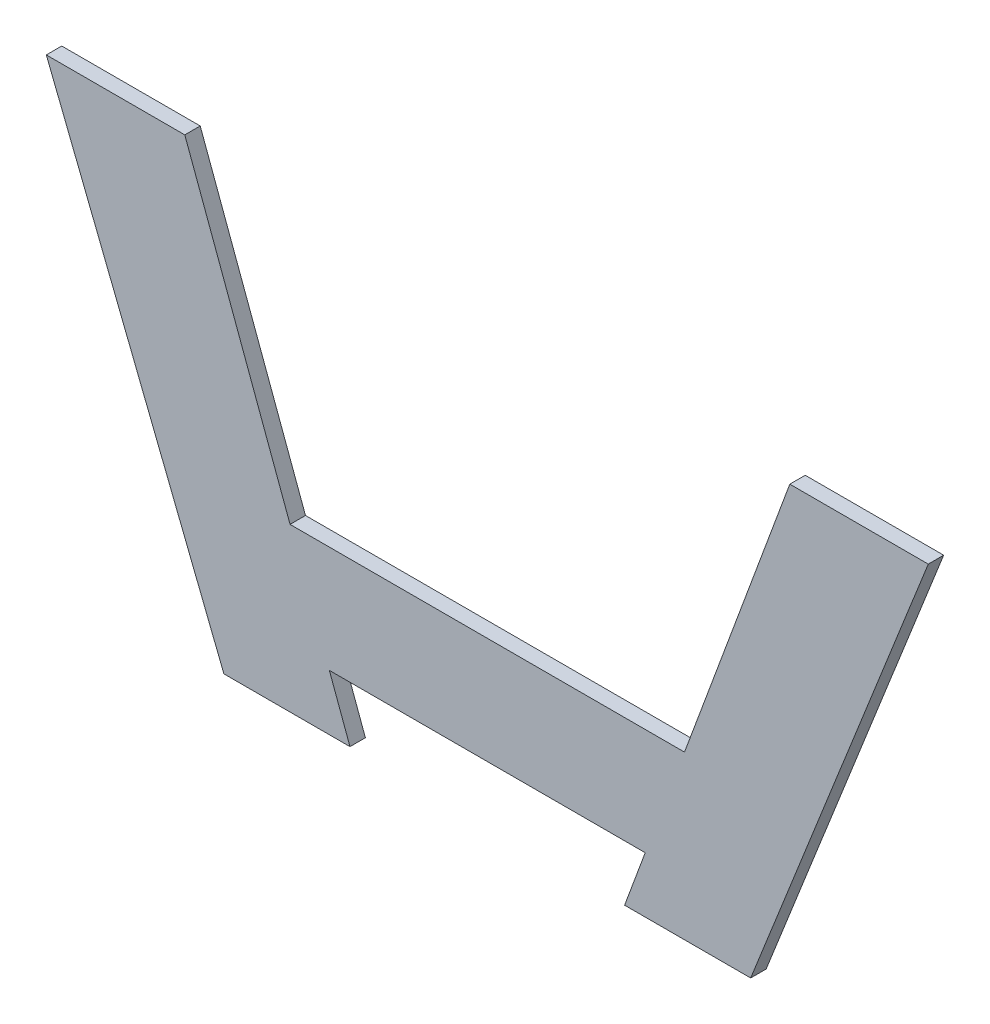
ISO-10303-21;
HEADER;
FILE_DESCRIPTION(('STEP AP214'),'2;1');
FILE_NAME('part.step','',(''),(''),'','','');
FILE_SCHEMA(('AUTOMOTIVE_DESIGN { 1 0 10303 214 1 1 1 1 }'));
ENDSEC;
DATA;
#1=APPLICATION_CONTEXT('core data for automotive mechanical design processes');
#2=APPLICATION_PROTOCOL_DEFINITION('international standard','automotive_design',2000,#1);
#3=PRODUCT_CONTEXT('',#1,'mechanical');
#4=PRODUCT('Part','Part','',(#3));
#5=PRODUCT_RELATED_PRODUCT_CATEGORY('part','',(#4));
#6=PRODUCT_DEFINITION_FORMATION('','',#4);
#7=PRODUCT_DEFINITION_CONTEXT('part definition',#1,'design');
#8=PRODUCT_DEFINITION('design','',#6,#7);
#9=PRODUCT_DEFINITION_SHAPE('','',#8);
#10=(LENGTH_UNIT() NAMED_UNIT(*) SI_UNIT(.MILLI.,.METRE.));
#11=(NAMED_UNIT(*) PLANE_ANGLE_UNIT() SI_UNIT($,.RADIAN.));
#12=(NAMED_UNIT(*) SI_UNIT($,.STERADIAN.) SOLID_ANGLE_UNIT());
#13=UNCERTAINTY_MEASURE_WITH_UNIT(LENGTH_MEASURE(1.E-05),#10,'distance_accuracy_value','');
#14=(GEOMETRIC_REPRESENTATION_CONTEXT(3) GLOBAL_UNCERTAINTY_ASSIGNED_CONTEXT((#13)) GLOBAL_UNIT_ASSIGNED_CONTEXT((#10,
#11,#12)) REPRESENTATION_CONTEXT('',''));
#15=CARTESIAN_POINT('',(0.,0.,0.));
#16=DIRECTION('',(0.,0.,1.));
#17=DIRECTION('',(1.,0.,0.));
#18=AXIS2_PLACEMENT_3D('',#15,#16,#17);
#19=CARTESIAN_POINT('',(14.4891826923077,15.,0.5));
#20=DIRECTION('',(-0.929423825762679,0.369014026975487,0.));
#21=DIRECTION('',(-0.369014026975487,-0.929423825762679,0.));
#22=AXIS2_PLACEMENT_3D('',#19,#20,#21);
#23=PLANE('',#22);
#24=DIRECTION('',(-0.369014026975487,-0.929423825762679,0.));
#25=VECTOR('',#24,1.);
#26=CARTESIAN_POINT('',(14.4891826923077,15.,1.));
#27=LINE('',#26,#25);
#28=CARTESIAN_POINT('',(14.4891826923077,15.,1.));
#29=VERTEX_POINT('',#28);
#30=CARTESIAN_POINT('',(8.73217147435897,0.5,1.));
#31=VERTEX_POINT('',#30);
#32=EDGE_CURVE('E163',#29,#31,#27,.T.);
#33=ORIENTED_EDGE('',*,*,#32,.T.);
#34=DIRECTION('',(0.,0.,-1.));
#35=VECTOR('',#34,1.);
#36=CARTESIAN_POINT('',(8.73217147435897,0.5,0.5));
#37=LINE('',#36,#35);
#38=CARTESIAN_POINT('',(8.73217147435897,0.5,0.5));
#39=VERTEX_POINT('',#38);
#40=EDGE_CURVE('E60',#31,#39,#37,.T.);
#41=ORIENTED_EDGE('',*,*,#40,.T.);
#42=DIRECTION('',(-0.369014026975487,-0.929423825762679,0.));
#43=VECTOR('',#42,1.);
#44=CARTESIAN_POINT('',(14.4891826923077,15.,0.5));
#45=LINE('',#44,#43);
#46=CARTESIAN_POINT('',(14.4891826923077,15.,0.5));
#47=VERTEX_POINT('',#46);
#48=EDGE_CURVE('E158',#47,#39,#45,.T.);
#49=ORIENTED_EDGE('',*,*,#48,.F.);
#50=DIRECTION('',(0.,0.,1.));
#51=VECTOR('',#50,1.);
#52=CARTESIAN_POINT('',(14.4891826923077,15.,0.5));
#53=LINE('',#52,#51);
#54=EDGE_CURVE('E137',#47,#29,#53,.T.);
#55=ORIENTED_EDGE('',*,*,#54,.T.);
#56=EDGE_LOOP('',(#33,#41,#49,#55));
#57=FACE_BOUND('',#56,.T.);
#58=ADVANCED_FACE('F39',(#57),#23,.F.);
#59=CARTESIAN_POINT('',(-2.19350961538462,-15.,0.5));
#60=DIRECTION('',(0.929423825762679,0.369014026975487,0.));
#61=DIRECTION('',(-0.369014026975487,0.929423825762679,0.));
#62=AXIS2_PLACEMENT_3D('',#59,#60,#61);
#63=PLANE('',#62);
#64=DIRECTION('',(-0.369014026975487,0.929423825762679,0.));
#65=VECTOR('',#64,1.);
#66=CARTESIAN_POINT('',(-2.19350961538462,-15.,0.5));
#67=LINE('',#66,#65);
#68=CARTESIAN_POINT('',(-8.34755608974359,0.5,0.5));
#69=VERTEX_POINT('',#68);
#70=CARTESIAN_POINT('',(-14.1045673076923,15.,0.5));
#71=VERTEX_POINT('',#70);
#72=EDGE_CURVE('E143',#69,#71,#67,.T.);
#73=ORIENTED_EDGE('',*,*,#72,.F.);
#74=DIRECTION('',(0.,0.,1.));
#75=VECTOR('',#74,1.);
#76=CARTESIAN_POINT('',(-8.34755608974359,0.5,0.5));
#77=LINE('',#76,#75);
#78=CARTESIAN_POINT('',(-8.34755608974359,0.5,1.));
#79=VERTEX_POINT('',#78);
#80=EDGE_CURVE('E135',#69,#79,#77,.T.);
#81=ORIENTED_EDGE('',*,*,#80,.T.);
#82=DIRECTION('',(-0.369014026975487,0.929423825762679,0.));
#83=VECTOR('',#82,1.);
#84=CARTESIAN_POINT('',(-2.19350961538462,-15.,1.));
#85=LINE('',#84,#83);
#86=CARTESIAN_POINT('',(-14.1045673076923,15.,1.));
#87=VERTEX_POINT('',#86);
#88=EDGE_CURVE('E138',#79,#87,#85,.T.);
#89=ORIENTED_EDGE('',*,*,#88,.T.);
#90=DIRECTION('',(0.,0.,1.));
#91=VECTOR('',#90,1.);
#92=CARTESIAN_POINT('',(-14.1045673076923,15.,0.5));
#93=LINE('',#92,#91);
#94=EDGE_CURVE('E152',#71,#87,#93,.T.);
#95=ORIENTED_EDGE('',*,*,#94,.F.);
#96=EDGE_LOOP('',(#73,#81,#89,#95));
#97=FACE_BOUND('',#96,.T.);
#98=ADVANCED_FACE('F146',(#97),#63,.F.);
#99=CARTESIAN_POINT('',(0.,0.,0.5));
#100=DIRECTION('',(0.,0.,-1.));
#101=DIRECTION('',(-1.,0.,0.));
#102=AXIS2_PLACEMENT_3D('',#99,#100,#101);
#103=PLANE('',#102);
#104=DIRECTION('',(1.,0.,0.));
#105=VECTOR('',#104,1.);
#106=CARTESIAN_POINT('',(0.,0.5,0.5));
#107=LINE('',#106,#105);
#108=CARTESIAN_POINT('',(-4.25964469981238,0.5,0.5));
#109=VERTEX_POINT('',#108);
#110=EDGE_CURVE('E47',#69,#109,#107,.T.);
#111=ORIENTED_EDGE('',*,*,#110,.F.);
#112=ORIENTED_EDGE('',*,*,#72,.T.);
#113=DIRECTION('',(1.,0.,0.));
#114=VECTOR('',#113,1.);
#115=CARTESIAN_POINT('',(-14.1045673076923,15.,0.5));
#116=LINE('',#115,#114);
#117=CARTESIAN_POINT('',(-9.61538461538462,15.,0.5));
#118=VERTEX_POINT('',#117);
#119=EDGE_CURVE('E155',#71,#118,#116,.T.);
#120=ORIENTED_EDGE('',*,*,#119,.T.);
#121=DIRECTION('',(0.346837004095032,-0.937925419524593,0.));
#122=VECTOR('',#121,1.);
#123=CARTESIAN_POINT('',(-9.61538461538462,15.,0.5));
#124=LINE('',#123,#122);
#125=CARTESIAN_POINT('',(-6.20192307692308,5.76923076923077,0.5));
#126=VERTEX_POINT('',#125);
#127=EDGE_CURVE('E153',#118,#126,#124,.T.);
#128=ORIENTED_EDGE('',*,*,#127,.T.);
#129=DIRECTION('',(1.,0.,0.));
#130=VECTOR('',#129,1.);
#131=CARTESIAN_POINT('',(-6.20192307692308,5.76923076923077,0.5));
#132=LINE('',#131,#130);
#133=CARTESIAN_POINT('',(6.58653846153846,5.76923076923077,0.5));
#134=VERTEX_POINT('',#133);
#135=EDGE_CURVE('E197',#126,#134,#132,.T.);
#136=ORIENTED_EDGE('',*,*,#135,.T.);
#137=DIRECTION('',(0.346837004095032,0.937925419524593,0.));
#138=VECTOR('',#137,1.);
#139=CARTESIAN_POINT('',(6.58653846153846,5.76923076923077,0.5));
#140=LINE('',#139,#138);
#141=CARTESIAN_POINT('',(10.,15.,0.5));
#142=VERTEX_POINT('',#141);
#143=EDGE_CURVE('E194',#134,#142,#140,.T.);
#144=ORIENTED_EDGE('',*,*,#143,.T.);
#145=DIRECTION('',(1.,0.,0.));
#146=VECTOR('',#145,1.);
#147=CARTESIAN_POINT('',(10.,15.,0.5));
#148=LINE('',#147,#146);
#149=EDGE_CURVE('E165',#142,#47,#148,.T.);
#150=ORIENTED_EDGE('',*,*,#149,.T.);
#151=ORIENTED_EDGE('',*,*,#48,.T.);
#152=CARTESIAN_POINT('',(4.64409857508627,0.5,0.5));
#153=VERTEX_POINT('',#152);
#154=EDGE_CURVE('E11',#153,#39,#107,.T.);
#155=ORIENTED_EDGE('',*,*,#154,.F.);
#156=DIRECTION('',(0.346805908159069,0.93793691795662,0.));
#157=VECTOR('',#156,1.);
#158=CARTESIAN_POINT('',(2.24158653846154,-5.99759615384616,0.5));
#159=LINE('',#158,#157);
#160=CARTESIAN_POINT('',(5.3125,2.30769230769231,0.5));
#161=VERTEX_POINT('',#160);
#162=EDGE_CURVE('E164',#153,#161,#159,.T.);
#163=ORIENTED_EDGE('',*,*,#162,.T.);
#164=DIRECTION('',(-1.,0.,0.));
#165=VECTOR('',#164,1.);
#166=CARTESIAN_POINT('',(5.3125,2.30769230769231,0.5));
#167=LINE('',#166,#165);
#168=CARTESIAN_POINT('',(-4.92788461538462,2.30769230769231,0.5));
#169=VERTEX_POINT('',#168);
#170=EDGE_CURVE('E170',#161,#169,#167,.T.);
#171=ORIENTED_EDGE('',*,*,#170,.T.);
#172=DIRECTION('',(0.346732183468385,-0.937964174660869,0.));
#173=VECTOR('',#172,1.);
#174=CARTESIAN_POINT('',(-4.92788461538462,2.30769230769231,0.5));
#175=LINE('',#174,#173);
#176=EDGE_CURVE('E150',#169,#109,#175,.T.);
#177=ORIENTED_EDGE('',*,*,#176,.T.);
#178=EDGE_LOOP('',(#111,#112,#120,#128,#136,#144,#150,#151,#155,#163,#171,#177));
#179=FACE_BOUND('',#178,.T.);
#180=ADVANCED_FACE('F142',(#179),#103,.T.);
#181=CARTESIAN_POINT('',(0.,0.,1.));
#182=DIRECTION('',(0.,0.,-1.));
#183=DIRECTION('',(-1.,0.,0.));
#184=AXIS2_PLACEMENT_3D('',#181,#182,#183);
#185=PLANE('',#184);
#186=ORIENTED_EDGE('',*,*,#88,.F.);
#187=DIRECTION('',(1.,0.,0.));
#188=VECTOR('',#187,1.);
#189=CARTESIAN_POINT('',(-17.,0.5,1.));
#190=LINE('',#189,#188);
#191=CARTESIAN_POINT('',(-4.25964469981238,0.5,1.));
#192=VERTEX_POINT('',#191);
#193=EDGE_CURVE('E132',#79,#192,#190,.T.);
#194=ORIENTED_EDGE('',*,*,#193,.T.);
#195=DIRECTION('',(0.346732183468385,-0.937964174660869,0.));
#196=VECTOR('',#195,1.);
#197=CARTESIAN_POINT('',(-4.92788461538462,2.30769230769231,1.));
#198=LINE('',#197,#196);
#199=CARTESIAN_POINT('',(-4.92788461538462,2.30769230769231,1.));
#200=VERTEX_POINT('',#199);
#201=EDGE_CURVE('E169',#200,#192,#198,.T.);
#202=ORIENTED_EDGE('',*,*,#201,.F.);
#203=DIRECTION('',(-1.,0.,0.));
#204=VECTOR('',#203,1.);
#205=CARTESIAN_POINT('',(5.3125,2.30769230769231,1.));
#206=LINE('',#205,#204);
#207=CARTESIAN_POINT('',(5.3125,2.30769230769231,1.));
#208=VERTEX_POINT('',#207);
#209=EDGE_CURVE('E184',#208,#200,#206,.T.);
#210=ORIENTED_EDGE('',*,*,#209,.F.);
#211=DIRECTION('',(0.346805908159069,0.93793691795662,0.));
#212=VECTOR('',#211,1.);
#213=CARTESIAN_POINT('',(2.24158653846154,-5.99759615384616,1.));
#214=LINE('',#213,#212);
#215=CARTESIAN_POINT('',(4.64409857508627,0.5,1.));
#216=VERTEX_POINT('',#215);
#217=EDGE_CURVE('E43',#216,#208,#214,.T.);
#218=ORIENTED_EDGE('',*,*,#217,.F.);
#219=EDGE_CURVE('E127',#216,#31,#190,.T.);
#220=ORIENTED_EDGE('',*,*,#219,.T.);
#221=ORIENTED_EDGE('',*,*,#32,.F.);
#222=DIRECTION('',(1.,0.,0.));
#223=VECTOR('',#222,1.);
#224=CARTESIAN_POINT('',(10.,15.,1.));
#225=LINE('',#224,#223);
#226=CARTESIAN_POINT('',(10.,15.,1.));
#227=VERTEX_POINT('',#226);
#228=EDGE_CURVE('E189',#227,#29,#225,.T.);
#229=ORIENTED_EDGE('',*,*,#228,.F.);
#230=DIRECTION('',(0.346837004095032,0.937925419524593,0.));
#231=VECTOR('',#230,1.);
#232=CARTESIAN_POINT('',(6.58653846153846,5.76923076923077,1.));
#233=LINE('',#232,#231);
#234=CARTESIAN_POINT('',(6.58653846153846,5.76923076923077,1.));
#235=VERTEX_POINT('',#234);
#236=EDGE_CURVE('E208',#235,#227,#233,.T.);
#237=ORIENTED_EDGE('',*,*,#236,.F.);
#238=DIRECTION('',(1.,0.,0.));
#239=VECTOR('',#238,1.);
#240=CARTESIAN_POINT('',(-6.20192307692308,5.76923076923077,1.));
#241=LINE('',#240,#239);
#242=CARTESIAN_POINT('',(-6.20192307692308,5.76923076923077,1.));
#243=VERTEX_POINT('',#242);
#244=EDGE_CURVE('E209',#243,#235,#241,.T.);
#245=ORIENTED_EDGE('',*,*,#244,.F.);
#246=DIRECTION('',(0.346837004095032,-0.937925419524593,0.));
#247=VECTOR('',#246,1.);
#248=CARTESIAN_POINT('',(-9.61538461538462,15.,1.));
#249=LINE('',#248,#247);
#250=CARTESIAN_POINT('',(-9.61538461538462,15.,1.));
#251=VERTEX_POINT('',#250);
#252=EDGE_CURVE('E204',#251,#243,#249,.T.);
#253=ORIENTED_EDGE('',*,*,#252,.F.);
#254=DIRECTION('',(1.,0.,0.));
#255=VECTOR('',#254,1.);
#256=CARTESIAN_POINT('',(-14.1045673076923,15.,1.));
#257=LINE('',#256,#255);
#258=EDGE_CURVE('E205',#87,#251,#257,.T.);
#259=ORIENTED_EDGE('',*,*,#258,.F.);
#260=EDGE_LOOP('',(#186,#194,#202,#210,#218,#220,#221,#229,#237,#245,#253,#259));
#261=FACE_BOUND('',#260,.T.);
#262=ADVANCED_FACE('F41',(#261),#185,.F.);
#263=CARTESIAN_POINT('',(2.24158653846154,-5.99759615384616,0.5));
#264=DIRECTION('',(0.93793691795662,-0.346805908159069,0.));
#265=DIRECTION('',(0.346805908159069,0.93793691795662,0.));
#266=AXIS2_PLACEMENT_3D('',#263,#264,#265);
#267=PLANE('',#266);
#268=ORIENTED_EDGE('',*,*,#162,.F.);
#269=DIRECTION('',(0.,0.,1.));
#270=VECTOR('',#269,1.);
#271=CARTESIAN_POINT('',(4.64409857508627,0.5,0.5));
#272=LINE('',#271,#270);
#273=EDGE_CURVE('E126',#153,#216,#272,.T.);
#274=ORIENTED_EDGE('',*,*,#273,.T.);
#275=ORIENTED_EDGE('',*,*,#217,.T.);
#276=DIRECTION('',(0.,0.,1.));
#277=VECTOR('',#276,1.);
#278=CARTESIAN_POINT('',(5.3125,2.30769230769231,0.5));
#279=LINE('',#278,#277);
#280=EDGE_CURVE('E149',#161,#208,#279,.T.);
#281=ORIENTED_EDGE('',*,*,#280,.F.);
#282=EDGE_LOOP('',(#268,#274,#275,#281));
#283=FACE_BOUND('',#282,.T.);
#284=ADVANCED_FACE('F240',(#283),#267,.F.);
#285=CARTESIAN_POINT('',(-4.92788461538462,2.30769230769231,0.5));
#286=DIRECTION('',(-0.937964174660869,-0.346732183468385,0.));
#287=DIRECTION('',(0.346732183468385,-0.937964174660869,0.));
#288=AXIS2_PLACEMENT_3D('',#285,#286,#287);
#289=PLANE('',#288);
#290=ORIENTED_EDGE('',*,*,#201,.T.);
#291=DIRECTION('',(0.,0.,-1.));
#292=VECTOR('',#291,1.);
#293=CARTESIAN_POINT('',(-4.25964469981238,0.5,0.5));
#294=LINE('',#293,#292);
#295=EDGE_CURVE('E72',#192,#109,#294,.T.);
#296=ORIENTED_EDGE('',*,*,#295,.T.);
#297=ORIENTED_EDGE('',*,*,#176,.F.);
#298=DIRECTION('',(0.,0.,1.));
#299=VECTOR('',#298,1.);
#300=CARTESIAN_POINT('',(-4.92788461538462,2.30769230769231,0.5));
#301=LINE('',#300,#299);
#302=EDGE_CURVE('E174',#169,#200,#301,.T.);
#303=ORIENTED_EDGE('',*,*,#302,.T.);
#304=EDGE_LOOP('',(#290,#296,#297,#303));
#305=FACE_BOUND('',#304,.T.);
#306=ADVANCED_FACE('F258',(#305),#289,.F.);
#307=CARTESIAN_POINT('',(10.,15.,0.5));
#308=DIRECTION('',(0.,-1.,0.));
#309=DIRECTION('',(0.,0.,-1.));
#310=AXIS2_PLACEMENT_3D('',#307,#308,#309);
#311=PLANE('',#310);
#312=ORIENTED_EDGE('',*,*,#228,.T.);
#313=ORIENTED_EDGE('',*,*,#54,.F.);
#314=ORIENTED_EDGE('',*,*,#149,.F.);
#315=DIRECTION('',(0.,0.,1.));
#316=VECTOR('',#315,1.);
#317=CARTESIAN_POINT('',(10.,15.,0.5));
#318=LINE('',#317,#316);
#319=EDGE_CURVE('E202',#142,#227,#318,.T.);
#320=ORIENTED_EDGE('',*,*,#319,.T.);
#321=EDGE_LOOP('',(#312,#313,#314,#320));
#322=FACE_BOUND('',#321,.T.);
#323=ADVANCED_FACE('F230',(#322),#311,.F.);
#324=CARTESIAN_POINT('',(-14.1045673076923,15.,0.5));
#325=DIRECTION('',(0.,-1.,0.));
#326=DIRECTION('',(0.,0.,-1.));
#327=AXIS2_PLACEMENT_3D('',#324,#325,#326);
#328=PLANE('',#327);
#329=ORIENTED_EDGE('',*,*,#258,.T.);
#330=DIRECTION('',(0.,0.,1.));
#331=VECTOR('',#330,1.);
#332=CARTESIAN_POINT('',(-9.61538461538462,15.,0.5));
#333=LINE('',#332,#331);
#334=EDGE_CURVE('E207',#118,#251,#333,.T.);
#335=ORIENTED_EDGE('',*,*,#334,.F.);
#336=ORIENTED_EDGE('',*,*,#119,.F.);
#337=ORIENTED_EDGE('',*,*,#94,.T.);
#338=EDGE_LOOP('',(#329,#335,#336,#337));
#339=FACE_BOUND('',#338,.T.);
#340=ADVANCED_FACE('F379',(#339),#328,.F.);
#341=CARTESIAN_POINT('',(-9.61538461538462,15.,0.5));
#342=DIRECTION('',(-0.937925419524593,-0.346837004095032,0.));
#343=DIRECTION('',(0.346837004095032,-0.937925419524593,0.));
#344=AXIS2_PLACEMENT_3D('',#341,#342,#343);
#345=PLANE('',#344);
#346=ORIENTED_EDGE('',*,*,#252,.T.);
#347=DIRECTION('',(0.,0.,1.));
#348=VECTOR('',#347,1.);
#349=CARTESIAN_POINT('',(-6.20192307692308,5.76923076923077,0.5));
#350=LINE('',#349,#348);
#351=EDGE_CURVE('E206',#126,#243,#350,.T.);
#352=ORIENTED_EDGE('',*,*,#351,.F.);
#353=ORIENTED_EDGE('',*,*,#127,.F.);
#354=ORIENTED_EDGE('',*,*,#334,.T.);
#355=EDGE_LOOP('',(#346,#352,#353,#354));
#356=FACE_BOUND('',#355,.T.);
#357=ADVANCED_FACE('F367',(#356),#345,.F.);
#358=CARTESIAN_POINT('',(-6.20192307692308,5.76923076923077,0.5));
#359=DIRECTION('',(0.,-1.,0.));
#360=DIRECTION('',(0.,0.,-1.));
#361=AXIS2_PLACEMENT_3D('',#358,#359,#360);
#362=PLANE('',#361);
#363=ORIENTED_EDGE('',*,*,#244,.T.);
#364=DIRECTION('',(0.,0.,1.));
#365=VECTOR('',#364,1.);
#366=CARTESIAN_POINT('',(6.58653846153846,5.76923076923077,0.5));
#367=LINE('',#366,#365);
#368=EDGE_CURVE('E187',#134,#235,#367,.T.);
#369=ORIENTED_EDGE('',*,*,#368,.F.);
#370=ORIENTED_EDGE('',*,*,#135,.F.);
#371=ORIENTED_EDGE('',*,*,#351,.T.);
#372=EDGE_LOOP('',(#363,#369,#370,#371));
#373=FACE_BOUND('',#372,.T.);
#374=ADVANCED_FACE('F357',(#373),#362,.F.);
#375=CARTESIAN_POINT('',(6.58653846153846,5.76923076923077,0.5));
#376=DIRECTION('',(0.937925419524593,-0.346837004095032,0.));
#377=DIRECTION('',(0.346837004095032,0.937925419524593,0.));
#378=AXIS2_PLACEMENT_3D('',#375,#376,#377);
#379=PLANE('',#378);
#380=ORIENTED_EDGE('',*,*,#236,.T.);
#381=ORIENTED_EDGE('',*,*,#319,.F.);
#382=ORIENTED_EDGE('',*,*,#143,.F.);
#383=ORIENTED_EDGE('',*,*,#368,.T.);
#384=EDGE_LOOP('',(#380,#381,#382,#383));
#385=FACE_BOUND('',#384,.T.);
#386=ADVANCED_FACE('F355',(#385),#379,.F.);
#387=CARTESIAN_POINT('',(5.3125,2.30769230769231,0.5));
#388=DIRECTION('',(0.,1.,0.));
#389=DIRECTION('',(0.,0.,1.));
#390=AXIS2_PLACEMENT_3D('',#387,#388,#389);
#391=PLANE('',#390);
#392=ORIENTED_EDGE('',*,*,#209,.T.);
#393=ORIENTED_EDGE('',*,*,#302,.F.);
#394=ORIENTED_EDGE('',*,*,#170,.F.);
#395=ORIENTED_EDGE('',*,*,#280,.T.);
#396=EDGE_LOOP('',(#392,#393,#394,#395));
#397=FACE_BOUND('',#396,.T.);
#398=ADVANCED_FACE('F234',(#397),#391,.F.);
#399=CARTESIAN_POINT('',(-17.,0.5,1.));
#400=DIRECTION('',(0.,1.,0.));
#401=DIRECTION('',(0.,0.,1.));
#402=AXIS2_PLACEMENT_3D('',#399,#400,#401);
#403=PLANE('',#402);
#404=ORIENTED_EDGE('',*,*,#110,.T.);
#405=ORIENTED_EDGE('',*,*,#295,.F.);
#406=ORIENTED_EDGE('',*,*,#193,.F.);
#407=ORIENTED_EDGE('',*,*,#80,.F.);
#408=EDGE_LOOP('',(#404,#405,#406,#407));
#409=FACE_BOUND('',#408,.T.);
#410=ADVANCED_FACE('F133',(#409),#403,.F.);
#411=ORIENTED_EDGE('',*,*,#219,.F.);
#412=ORIENTED_EDGE('',*,*,#273,.F.);
#413=ORIENTED_EDGE('',*,*,#154,.T.);
#414=ORIENTED_EDGE('',*,*,#40,.F.);
#415=EDGE_LOOP('',(#411,#412,#413,#414));
#416=FACE_BOUND('',#415,.T.);
#417=ADVANCED_FACE('F239',(#416),#403,.F.);
#418=CLOSED_SHELL('',(#58,#98,#180,#262,#284,#306,#323,#340,#357,#374,#386,#398,#410,#417));
#419=MANIFOLD_SOLID_BREP('B2',#418);
#420=ADVANCED_BREP_SHAPE_REPRESENTATION('',(#18,#419),#14);
#421=SHAPE_DEFINITION_REPRESENTATION(#9,#420);
ENDSEC;
END-ISO-10303-21;
